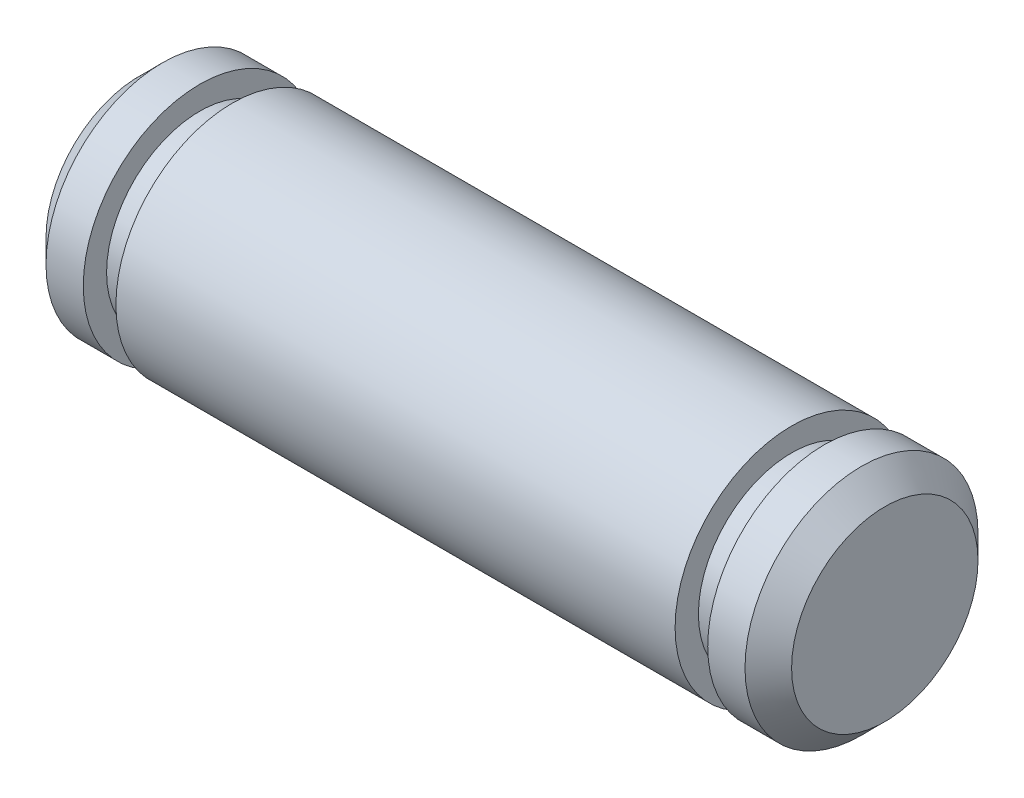
ISO-10303-21;
HEADER;
FILE_DESCRIPTION(('STEP AP214'),'2;1');
FILE_NAME('part.step','',(''),(''),'','','');
FILE_SCHEMA(('AUTOMOTIVE_DESIGN { 1 0 10303 214 1 1 1 1 }'));
ENDSEC;
DATA;
#1=APPLICATION_CONTEXT('core data for automotive mechanical design processes');
#2=APPLICATION_PROTOCOL_DEFINITION('international standard','automotive_design',2000,#1);
#3=PRODUCT_CONTEXT('',#1,'mechanical');
#4=PRODUCT('Part','Part','',(#3));
#5=PRODUCT_RELATED_PRODUCT_CATEGORY('part','',(#4));
#6=PRODUCT_DEFINITION_FORMATION('','',#4);
#7=PRODUCT_DEFINITION_CONTEXT('part definition',#1,'design');
#8=PRODUCT_DEFINITION('design','',#6,#7);
#9=PRODUCT_DEFINITION_SHAPE('','',#8);
#10=(LENGTH_UNIT() NAMED_UNIT(*) SI_UNIT(.MILLI.,.METRE.));
#11=(NAMED_UNIT(*) PLANE_ANGLE_UNIT() SI_UNIT($,.RADIAN.));
#12=(NAMED_UNIT(*) SI_UNIT($,.STERADIAN.) SOLID_ANGLE_UNIT());
#13=UNCERTAINTY_MEASURE_WITH_UNIT(LENGTH_MEASURE(1.E-05),#10,'distance_accuracy_value','');
#14=(GEOMETRIC_REPRESENTATION_CONTEXT(3) GLOBAL_UNCERTAINTY_ASSIGNED_CONTEXT((#13)) GLOBAL_UNIT_ASSIGNED_CONTEXT((#10,
#11,#12)) REPRESENTATION_CONTEXT('',''));
#15=CARTESIAN_POINT('',(0.,0.,0.));
#16=DIRECTION('',(0.,0.,1.));
#17=DIRECTION('',(1.,0.,0.));
#18=AXIS2_PLACEMENT_3D('',#15,#16,#17);
#19=CARTESIAN_POINT('',(16.,2.,0.));
#20=DIRECTION('',(-1.,0.,0.));
#21=DIRECTION('',(0.,0.,1.));
#22=AXIS2_PLACEMENT_3D('',#19,#20,#21);
#23=PLANE('',#22);
#24=CARTESIAN_POINT('',(16.0000000000196,0.,0.));
#25=DIRECTION('',(-1.,0.,0.));
#26=DIRECTION('',(0.,0.,1.));
#27=AXIS2_PLACEMENT_3D('',#24,#25,#26);
#28=CIRCLE('',#27,1.99999999995271);
#29=CARTESIAN_POINT('',(16.0000000000196,0.,1.99999999995271));
#30=VERTEX_POINT('',#29);
#31=EDGE_CURVE('E18',#30,#30,#28,.T.);
#32=ORIENTED_EDGE('',*,*,#31,.F.);
#33=EDGE_LOOP('',(#32));
#34=FACE_BOUND('',#33,.T.);
#35=ADVANCED_FACE('F15',(#34),#23,.F.);
#36=CARTESIAN_POINT('',(0.,0.,0.));
#37=DIRECTION('',(1.,0.,0.));
#38=DIRECTION('',(0.,0.,-1.));
#39=AXIS2_PLACEMENT_3D('',#36,#37,#38);
#40=PLANE('',#39);
#41=CARTESIAN_POINT('',(5.6843418860808E-11,0.,0.));
#42=DIRECTION('',(1.,0.,0.));
#43=DIRECTION('',(0.,0.,-1.));
#44=AXIS2_PLACEMENT_3D('',#41,#42,#43);
#45=CIRCLE('',#44,2.00000000000955);
#46=CARTESIAN_POINT('',(5.6843418860808E-11,0.,-2.00000000000955));
#47=VERTEX_POINT('',#46);
#48=EDGE_CURVE('E50',#47,#47,#45,.T.);
#49=ORIENTED_EDGE('',*,*,#48,.F.);
#50=EDGE_LOOP('',(#49));
#51=FACE_BOUND('',#50,.T.);
#52=ADVANCED_FACE('F62',(#51),#40,.F.);
#53=CARTESIAN_POINT('',(15.5000000000882,0.,0.));
#54=DIRECTION('',(-1.,0.,0.));
#55=DIRECTION('',(0.,0.,1.));
#56=AXIS2_PLACEMENT_3D('',#53,#54,#55);
#57=CONICAL_SURFACE('',#56,2.49999999988404,0.785398163397448);
#58=CARTESIAN_POINT('',(15.5,0.,0.));
#59=DIRECTION('',(-1.,0.,0.));
#60=DIRECTION('',(0.,0.,1.));
#61=AXIS2_PLACEMENT_3D('',#58,#59,#60);
#62=CIRCLE('',#61,2.5);
#63=CARTESIAN_POINT('',(15.5,0.,2.5));
#64=VERTEX_POINT('',#63);
#65=EDGE_CURVE('E52',#64,#64,#62,.T.);
#66=ORIENTED_EDGE('',*,*,#65,.F.);
#67=EDGE_LOOP('',(#66));
#68=FACE_BOUND('',#67,.T.);
#69=ORIENTED_EDGE('',*,*,#31,.T.);
#70=EDGE_LOOP('',(#69));
#71=FACE_BOUND('',#70,.T.);
#72=ADVANCED_FACE('F59',(#68,#71),#57,.T.);
#73=CARTESIAN_POINT('',(0.499999999988177,0.,0.));
#74=DIRECTION('',(1.,0.,0.));
#75=DIRECTION('',(0.,0.,-1.));
#76=AXIS2_PLACEMENT_3D('',#73,#74,#75);
#77=CONICAL_SURFACE('',#76,2.49999999994088,0.785398163397448);
#78=ORIENTED_EDGE('',*,*,#48,.T.);
#79=EDGE_LOOP('',(#78));
#80=FACE_BOUND('',#79,.T.);
#81=CARTESIAN_POINT('',(0.5,0.,0.));
#82=DIRECTION('',(-1.,0.,0.));
#83=DIRECTION('',(0.,0.,1.));
#84=AXIS2_PLACEMENT_3D('',#81,#82,#83);
#85=CIRCLE('',#84,2.5);
#86=CARTESIAN_POINT('',(0.5,0.,2.5));
#87=VERTEX_POINT('',#86);
#88=EDGE_CURVE('E49',#87,#87,#85,.F.);
#89=ORIENTED_EDGE('',*,*,#88,.F.);
#90=EDGE_LOOP('',(#89));
#91=FACE_BOUND('',#90,.T.);
#92=ADVANCED_FACE('F106',(#80,#91),#77,.T.);
#93=CARTESIAN_POINT('',(16.,0.,0.));
#94=DIRECTION('',(-1.,0.,0.));
#95=DIRECTION('',(0.,0.,1.));
#96=AXIS2_PLACEMENT_3D('',#93,#94,#95);
#97=CYLINDRICAL_SURFACE('',#96,2.5);
#98=CARTESIAN_POINT('',(14.7,0.,0.));
#99=DIRECTION('',(-1.,0.,0.));
#100=DIRECTION('',(0.,0.,1.));
#101=AXIS2_PLACEMENT_3D('',#98,#99,#100);
#102=CIRCLE('',#101,2.5);
#103=CARTESIAN_POINT('',(14.7,0.,2.5));
#104=VERTEX_POINT('',#103);
#105=EDGE_CURVE('E47',#104,#104,#102,.F.);
#106=ORIENTED_EDGE('',*,*,#105,.T.);
#107=EDGE_LOOP('',(#106));
#108=FACE_BOUND('',#107,.T.);
#109=ORIENTED_EDGE('',*,*,#65,.T.);
#110=EDGE_LOOP('',(#109));
#111=FACE_BOUND('',#110,.T.);
#112=ADVANCED_FACE('F102',(#108,#111),#97,.T.);
#113=CARTESIAN_POINT('',(16.,0.,0.));
#114=DIRECTION('',(-1.,0.,0.));
#115=DIRECTION('',(0.,0.,1.));
#116=AXIS2_PLACEMENT_3D('',#113,#114,#115);
#117=CYLINDRICAL_SURFACE('',#116,2.5);
#118=ORIENTED_EDGE('',*,*,#88,.T.);
#119=EDGE_LOOP('',(#118));
#120=FACE_BOUND('',#119,.T.);
#121=CARTESIAN_POINT('',(1.3,0.,0.));
#122=DIRECTION('',(-1.,0.,0.));
#123=DIRECTION('',(0.,0.,1.));
#124=AXIS2_PLACEMENT_3D('',#121,#122,#123);
#125=CIRCLE('',#124,2.5);
#126=CARTESIAN_POINT('',(1.3,0.,2.5));
#127=VERTEX_POINT('',#126);
#128=EDGE_CURVE('E44',#127,#127,#125,.T.);
#129=ORIENTED_EDGE('',*,*,#128,.T.);
#130=EDGE_LOOP('',(#129));
#131=FACE_BOUND('',#130,.T.);
#132=ADVANCED_FACE('F98',(#120,#131),#117,.T.);
#133=CARTESIAN_POINT('',(14.7,2.,0.));
#134=DIRECTION('',(1.,0.,0.));
#135=DIRECTION('',(0.,0.,-1.));
#136=AXIS2_PLACEMENT_3D('',#133,#134,#135);
#137=PLANE('',#136);
#138=CARTESIAN_POINT('',(14.7,0.,0.));
#139=DIRECTION('',(-1.,0.,0.));
#140=DIRECTION('',(0.,0.,1.));
#141=AXIS2_PLACEMENT_3D('',#138,#139,#140);
#142=CIRCLE('',#141,2.);
#143=CARTESIAN_POINT('',(14.7,0.,2.));
#144=VERTEX_POINT('',#143);
#145=EDGE_CURVE('E41',#144,#144,#142,.T.);
#146=ORIENTED_EDGE('',*,*,#145,.F.);
#147=EDGE_LOOP('',(#146));
#148=FACE_BOUND('',#147,.T.);
#149=ORIENTED_EDGE('',*,*,#105,.F.);
#150=EDGE_LOOP('',(#149));
#151=FACE_BOUND('',#150,.T.);
#152=ADVANCED_FACE('F94',(#148,#151),#137,.F.);
#153=CARTESIAN_POINT('',(1.3,2.5,0.));
#154=DIRECTION('',(-1.,0.,0.));
#155=DIRECTION('',(0.,0.,1.));
#156=AXIS2_PLACEMENT_3D('',#153,#154,#155);
#157=PLANE('',#156);
#158=ORIENTED_EDGE('',*,*,#128,.F.);
#159=EDGE_LOOP('',(#158));
#160=FACE_BOUND('',#159,.T.);
#161=CARTESIAN_POINT('',(1.3,0.,0.));
#162=DIRECTION('',(-1.,0.,0.));
#163=DIRECTION('',(0.,0.,1.));
#164=AXIS2_PLACEMENT_3D('',#161,#162,#163);
#165=CIRCLE('',#164,2.);
#166=CARTESIAN_POINT('',(1.3,0.,2.));
#167=VERTEX_POINT('',#166);
#168=EDGE_CURVE('E38',#167,#167,#165,.F.);
#169=ORIENTED_EDGE('',*,*,#168,.F.);
#170=EDGE_LOOP('',(#169));
#171=FACE_BOUND('',#170,.T.);
#172=ADVANCED_FACE('F90',(#160,#171),#157,.F.);
#173=CARTESIAN_POINT('',(16.,0.,0.));
#174=DIRECTION('',(-1.,0.,0.));
#175=DIRECTION('',(0.,0.,1.));
#176=AXIS2_PLACEMENT_3D('',#173,#174,#175);
#177=CYLINDRICAL_SURFACE('',#176,2.);
#178=CARTESIAN_POINT('',(14.,0.,0.));
#179=DIRECTION('',(-1.,0.,0.));
#180=DIRECTION('',(0.,0.,1.));
#181=AXIS2_PLACEMENT_3D('',#178,#179,#180);
#182=CIRCLE('',#181,2.);
#183=CARTESIAN_POINT('',(14.,0.,2.));
#184=VERTEX_POINT('',#183);
#185=EDGE_CURVE('E35',#184,#184,#182,.F.);
#186=ORIENTED_EDGE('',*,*,#185,.T.);
#187=EDGE_LOOP('',(#186));
#188=FACE_BOUND('',#187,.T.);
#189=ORIENTED_EDGE('',*,*,#145,.T.);
#190=EDGE_LOOP('',(#189));
#191=FACE_BOUND('',#190,.T.);
#192=ADVANCED_FACE('F86',(#188,#191),#177,.T.);
#193=CARTESIAN_POINT('',(16.,0.,0.));
#194=DIRECTION('',(-1.,0.,0.));
#195=DIRECTION('',(0.,0.,1.));
#196=AXIS2_PLACEMENT_3D('',#193,#194,#195);
#197=CYLINDRICAL_SURFACE('',#196,2.);
#198=ORIENTED_EDGE('',*,*,#168,.T.);
#199=EDGE_LOOP('',(#198));
#200=FACE_BOUND('',#199,.T.);
#201=CARTESIAN_POINT('',(2.,0.,0.));
#202=DIRECTION('',(-1.,0.,0.));
#203=DIRECTION('',(0.,0.,1.));
#204=AXIS2_PLACEMENT_3D('',#201,#202,#203);
#205=CIRCLE('',#204,2.);
#206=CARTESIAN_POINT('',(2.,0.,2.));
#207=VERTEX_POINT('',#206);
#208=EDGE_CURVE('E27',#207,#207,#205,.T.);
#209=ORIENTED_EDGE('',*,*,#208,.T.);
#210=EDGE_LOOP('',(#209));
#211=FACE_BOUND('',#210,.T.);
#212=ADVANCED_FACE('F82',(#200,#211),#197,.T.);
#213=CARTESIAN_POINT('',(14.,2.5,0.));
#214=DIRECTION('',(-1.,0.,0.));
#215=DIRECTION('',(0.,0.,1.));
#216=AXIS2_PLACEMENT_3D('',#213,#214,#215);
#217=PLANE('',#216);
#218=CARTESIAN_POINT('',(14.,0.,0.));
#219=DIRECTION('',(-1.,0.,0.));
#220=DIRECTION('',(0.,0.,1.));
#221=AXIS2_PLACEMENT_3D('',#218,#219,#220);
#222=CIRCLE('',#221,2.5);
#223=CARTESIAN_POINT('',(14.,0.,2.5));
#224=VERTEX_POINT('',#223);
#225=EDGE_CURVE('E22',#224,#224,#222,.T.);
#226=ORIENTED_EDGE('',*,*,#225,.F.);
#227=EDGE_LOOP('',(#226));
#228=FACE_BOUND('',#227,.T.);
#229=ORIENTED_EDGE('',*,*,#185,.F.);
#230=EDGE_LOOP('',(#229));
#231=FACE_BOUND('',#230,.T.);
#232=ADVANCED_FACE('F75',(#228,#231),#217,.F.);
#233=CARTESIAN_POINT('',(2.,2.,0.));
#234=DIRECTION('',(1.,0.,0.));
#235=DIRECTION('',(0.,0.,-1.));
#236=AXIS2_PLACEMENT_3D('',#233,#234,#235);
#237=PLANE('',#236);
#238=ORIENTED_EDGE('',*,*,#208,.F.);
#239=EDGE_LOOP('',(#238));
#240=FACE_BOUND('',#239,.T.);
#241=CARTESIAN_POINT('',(2.,0.,0.));
#242=DIRECTION('',(-1.,0.,0.));
#243=DIRECTION('',(0.,0.,1.));
#244=AXIS2_PLACEMENT_3D('',#241,#242,#243);
#245=CIRCLE('',#244,2.5);
#246=CARTESIAN_POINT('',(2.,0.,2.5));
#247=VERTEX_POINT('',#246);
#248=EDGE_CURVE('E10',#247,#247,#245,.F.);
#249=ORIENTED_EDGE('',*,*,#248,.F.);
#250=EDGE_LOOP('',(#249));
#251=FACE_BOUND('',#250,.T.);
#252=ADVANCED_FACE('F70',(#240,#251),#237,.F.);
#253=CARTESIAN_POINT('',(16.,0.,0.));
#254=DIRECTION('',(-1.,0.,0.));
#255=DIRECTION('',(0.,0.,1.));
#256=AXIS2_PLACEMENT_3D('',#253,#254,#255);
#257=CYLINDRICAL_SURFACE('',#256,2.5);
#258=ORIENTED_EDGE('',*,*,#248,.T.);
#259=EDGE_LOOP('',(#258));
#260=FACE_BOUND('',#259,.T.);
#261=ORIENTED_EDGE('',*,*,#225,.T.);
#262=EDGE_LOOP('',(#261));
#263=FACE_BOUND('',#262,.T.);
#264=ADVANCED_FACE('F68',(#260,#263),#257,.T.);
#265=CLOSED_SHELL('',(#35,#52,#72,#92,#112,#132,#152,#172,#192,#212,#232,#252,#264));
#266=MANIFOLD_SOLID_BREP('B1',#265);
#267=ADVANCED_BREP_SHAPE_REPRESENTATION('',(#18,#266),#14);
#268=SHAPE_DEFINITION_REPRESENTATION(#9,#267);
ENDSEC;
END-ISO-10303-21;
